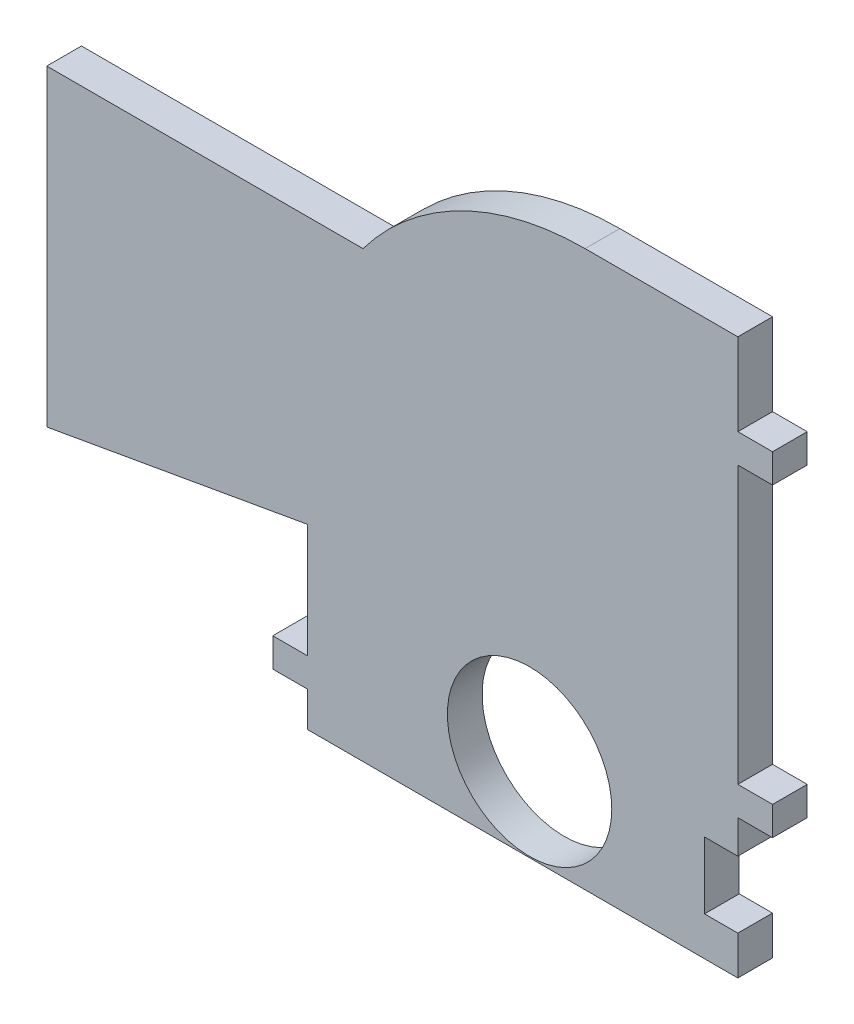
ISO-10303-21;
HEADER;
FILE_DESCRIPTION(('STEP AP214'),'2;1');
FILE_NAME('part.step','',(''),(''),'','','');
FILE_SCHEMA(('AUTOMOTIVE_DESIGN { 1 0 10303 214 1 1 1 1 }'));
ENDSEC;
DATA;
#1=APPLICATION_CONTEXT('core data for automotive mechanical design processes');
#2=APPLICATION_PROTOCOL_DEFINITION('international standard','automotive_design',2000,#1);
#3=PRODUCT_CONTEXT('',#1,'mechanical');
#4=PRODUCT('Part','Part','',(#3));
#5=PRODUCT_RELATED_PRODUCT_CATEGORY('part','',(#4));
#6=PRODUCT_DEFINITION_FORMATION('','',#4);
#7=PRODUCT_DEFINITION_CONTEXT('part definition',#1,'design');
#8=PRODUCT_DEFINITION('design','',#6,#7);
#9=PRODUCT_DEFINITION_SHAPE('','',#8);
#10=(LENGTH_UNIT() NAMED_UNIT(*) SI_UNIT(.MILLI.,.METRE.));
#11=(NAMED_UNIT(*) PLANE_ANGLE_UNIT() SI_UNIT($,.RADIAN.));
#12=(NAMED_UNIT(*) SI_UNIT($,.STERADIAN.) SOLID_ANGLE_UNIT());
#13=UNCERTAINTY_MEASURE_WITH_UNIT(LENGTH_MEASURE(1.E-05),#10,'distance_accuracy_value','');
#14=(GEOMETRIC_REPRESENTATION_CONTEXT(3) GLOBAL_UNCERTAINTY_ASSIGNED_CONTEXT((#13)) GLOBAL_UNIT_ASSIGNED_CONTEXT((#10,
#11,#12)) REPRESENTATION_CONTEXT('',''));
#15=CARTESIAN_POINT('',(0.,0.,0.));
#16=DIRECTION('',(0.,0.,1.));
#17=DIRECTION('',(1.,0.,0.));
#18=AXIS2_PLACEMENT_3D('',#15,#16,#17);
#19=CARTESIAN_POINT('',(-5.48621075951461,21.59,1.5875));
#20=DIRECTION('',(0.,1.,0.));
#21=DIRECTION('',(-1.,0.,0.));
#22=AXIS2_PLACEMENT_3D('',#19,#20,#21);
#23=PLANE('',#22);
#24=DIRECTION('',(1.,0.,0.));
#25=VECTOR('',#24,1.);
#26=CARTESIAN_POINT('',(-5.48621075951461,21.59,0.));
#27=LINE('',#26,#25);
#28=CARTESIAN_POINT('',(2.53999999999987,21.59,0.));
#29=VERTEX_POINT('',#28);
#30=CARTESIAN_POINT('',(9.52499999999987,21.59,0.));
#31=VERTEX_POINT('',#30);
#32=EDGE_CURVE('E231',#29,#31,#27,.T.);
#33=ORIENTED_EDGE('',*,*,#32,.F.);
#34=DIRECTION('',(0.,0.,-1.));
#35=VECTOR('',#34,1.);
#36=CARTESIAN_POINT('',(2.53999999999987,21.59,1.5875));
#37=LINE('',#36,#35);
#38=CARTESIAN_POINT('',(2.53999999999987,21.59,1.5875));
#39=VERTEX_POINT('',#38);
#40=EDGE_CURVE('E11',#39,#29,#37,.T.);
#41=ORIENTED_EDGE('',*,*,#40,.F.);
#42=DIRECTION('',(1.,0.,0.));
#43=VECTOR('',#42,1.);
#44=CARTESIAN_POINT('',(-5.48621075951461,21.59,1.5875));
#45=LINE('',#44,#43);
#46=CARTESIAN_POINT('',(9.52499999999987,21.59,1.5875));
#47=VERTEX_POINT('',#46);
#48=EDGE_CURVE('E432',#39,#47,#45,.T.);
#49=ORIENTED_EDGE('',*,*,#48,.T.);
#50=DIRECTION('',(0.,0.,-1.));
#51=VECTOR('',#50,1.);
#52=CARTESIAN_POINT('',(9.52499999999987,21.59,1.5875));
#53=LINE('',#52,#51);
#54=EDGE_CURVE('E52',#47,#31,#53,.T.);
#55=ORIENTED_EDGE('',*,*,#54,.T.);
#56=EDGE_LOOP('',(#33,#41,#49,#55));
#57=FACE_BOUND('',#56,.T.);
#58=ADVANCED_FACE('F35',(#57),#23,.T.);
#59=CARTESIAN_POINT('',(2.53999999999988,8.89,1.5875));
#60=DIRECTION('',(0.,0.,-1.));
#61=DIRECTION('',(-1.,0.,0.));
#62=AXIS2_PLACEMENT_3D('',#59,#60,#61);
#63=CYLINDRICAL_SURFACE('',#62,12.7);
#64=CARTESIAN_POINT('',(2.53999999999988,8.89,0.));
#65=DIRECTION('',(0.,0.,1.));
#66=DIRECTION('',(1.,0.,0.));
#67=AXIS2_PLACEMENT_3D('',#64,#65,#66);
#68=CIRCLE('',#67,12.7);
#69=CARTESIAN_POINT('',(-7.62000000000013,16.51,0.));
#70=VERTEX_POINT('',#69);
#71=EDGE_CURVE('E233',#29,#70,#68,.T.);
#72=ORIENTED_EDGE('',*,*,#71,.T.);
#73=DIRECTION('',(0.,0.,-1.));
#74=VECTOR('',#73,1.);
#75=CARTESIAN_POINT('',(-7.62000000000013,16.51,1.5875));
#76=LINE('',#75,#74);
#77=CARTESIAN_POINT('',(-7.62000000000013,16.51,1.5875));
#78=VERTEX_POINT('',#77);
#79=EDGE_CURVE('E44',#78,#70,#76,.T.);
#80=ORIENTED_EDGE('',*,*,#79,.F.);
#81=CARTESIAN_POINT('',(2.53999999999988,8.89,1.5875));
#82=DIRECTION('',(0.,0.,1.));
#83=DIRECTION('',(1.,0.,0.));
#84=AXIS2_PLACEMENT_3D('',#81,#82,#83);
#85=CIRCLE('',#84,12.7);
#86=EDGE_CURVE('E434',#39,#78,#85,.T.);
#87=ORIENTED_EDGE('',*,*,#86,.F.);
#88=ORIENTED_EDGE('',*,*,#40,.T.);
#89=EDGE_LOOP('',(#72,#80,#87,#88));
#90=FACE_BOUND('',#89,.T.);
#91=ADVANCED_FACE('F342',(#90),#63,.T.);
#92=CARTESIAN_POINT('',(-5.48621075951466,16.51,1.5875));
#93=DIRECTION('',(0.,-1.,0.));
#94=DIRECTION('',(1.,0.,0.));
#95=AXIS2_PLACEMENT_3D('',#92,#93,#94);
#96=PLANE('',#95);
#97=DIRECTION('',(-1.,0.,0.));
#98=VECTOR('',#97,1.);
#99=CARTESIAN_POINT('',(-5.48621075951466,16.51,0.));
#100=LINE('',#99,#98);
#101=CARTESIAN_POINT('',(-22.0849215190291,16.51,0.));
#102=VERTEX_POINT('',#101);
#103=EDGE_CURVE('E236',#70,#102,#100,.T.);
#104=ORIENTED_EDGE('',*,*,#103,.T.);
#105=DIRECTION('',(0.,0.,-1.));
#106=VECTOR('',#105,1.);
#107=CARTESIAN_POINT('',(-22.0849215190291,16.51,1.5875));
#108=LINE('',#107,#106);
#109=CARTESIAN_POINT('',(-22.0849215190291,16.51,1.5875));
#110=VERTEX_POINT('',#109);
#111=EDGE_CURVE('E332',#110,#102,#108,.T.);
#112=ORIENTED_EDGE('',*,*,#111,.F.);
#113=DIRECTION('',(-1.,0.,0.));
#114=VECTOR('',#113,1.);
#115=CARTESIAN_POINT('',(-5.48621075951466,16.51,1.5875));
#116=LINE('',#115,#114);
#117=EDGE_CURVE('E338',#78,#110,#116,.T.);
#118=ORIENTED_EDGE('',*,*,#117,.F.);
#119=ORIENTED_EDGE('',*,*,#79,.T.);
#120=EDGE_LOOP('',(#104,#112,#118,#119));
#121=FACE_BOUND('',#120,.T.);
#122=ADVANCED_FACE('F336',(#121),#96,.F.);
#123=CARTESIAN_POINT('',(-22.0849215190291,-23.764086908062,1.5875));
#124=DIRECTION('',(-1.,0.,0.));
#125=DIRECTION('',(0.,0.,1.));
#126=AXIS2_PLACEMENT_3D('',#123,#124,#125);
#127=PLANE('',#126);
#128=DIRECTION('',(0.,1.,0.));
#129=VECTOR('',#128,1.);
#130=CARTESIAN_POINT('',(-22.0849215190291,-23.764086908062,0.));
#131=LINE('',#130,#129);
#132=CARTESIAN_POINT('',(-22.0849215190291,2.21200741234465,0.));
#133=VERTEX_POINT('',#132);
#134=EDGE_CURVE('E239',#133,#102,#131,.T.);
#135=ORIENTED_EDGE('',*,*,#134,.F.);
#136=DIRECTION('',(0.,0.,-1.));
#137=VECTOR('',#136,1.);
#138=CARTESIAN_POINT('',(-22.0849215190291,2.21200741234465,1.5875));
#139=LINE('',#138,#137);
#140=CARTESIAN_POINT('',(-22.0849215190291,2.21200741234465,1.5875));
#141=VERTEX_POINT('',#140);
#142=EDGE_CURVE('E330',#141,#133,#139,.T.);
#143=ORIENTED_EDGE('',*,*,#142,.F.);
#144=DIRECTION('',(0.,1.,0.));
#145=VECTOR('',#144,1.);
#146=CARTESIAN_POINT('',(-22.0849215190291,-23.764086908062,1.5875));
#147=LINE('',#146,#145);
#148=EDGE_CURVE('E439',#141,#110,#147,.T.);
#149=ORIENTED_EDGE('',*,*,#148,.T.);
#150=ORIENTED_EDGE('',*,*,#111,.T.);
#151=EDGE_LOOP('',(#135,#143,#149,#150));
#152=FACE_BOUND('',#151,.T.);
#153=ADVANCED_FACE('F354',(#152),#127,.T.);
#154=CARTESIAN_POINT('',(-10.4369894152439,4.26908247425933,1.5875));
#155=DIRECTION('',(-0.173913043478261,0.984761013296185,0.));
#156=DIRECTION('',(-0.984761013296185,-0.173913043478261,0.));
#157=AXIS2_PLACEMENT_3D('',#154,#155,#156);
#158=PLANE('',#157);
#159=DIRECTION('',(0.984761013296185,0.173913043478261,0.));
#160=VECTOR('',#159,1.);
#161=CARTESIAN_POINT('',(-10.4369894152439,4.26908247425933,0.));
#162=LINE('',#161,#160);
#163=CARTESIAN_POINT('',(-10.1600000000001,4.31799999999998,0.));
#164=VERTEX_POINT('',#163);
#165=EDGE_CURVE('E242',#133,#164,#162,.T.);
#166=ORIENTED_EDGE('',*,*,#165,.T.);
#167=DIRECTION('',(0.,0.,-1.));
#168=VECTOR('',#167,1.);
#169=CARTESIAN_POINT('',(-10.1600000000001,4.31799999999998,1.5875));
#170=LINE('',#169,#168);
#171=CARTESIAN_POINT('',(-10.1600000000001,4.31799999999998,1.5875));
#172=VERTEX_POINT('',#171);
#173=EDGE_CURVE('E327',#172,#164,#170,.T.);
#174=ORIENTED_EDGE('',*,*,#173,.F.);
#175=DIRECTION('',(0.984761013296185,0.173913043478261,0.));
#176=VECTOR('',#175,1.);
#177=CARTESIAN_POINT('',(-10.4369894152439,4.26908247425933,1.5875));
#178=LINE('',#177,#176);
#179=EDGE_CURVE('E442',#141,#172,#178,.T.);
#180=ORIENTED_EDGE('',*,*,#179,.F.);
#181=ORIENTED_EDGE('',*,*,#142,.T.);
#182=EDGE_LOOP('',(#166,#174,#180,#181));
#183=FACE_BOUND('',#182,.T.);
#184=ADVANCED_FACE('F357',(#183),#158,.F.);
#185=CARTESIAN_POINT('',(-10.1600000000001,-23.764086908062,1.5875));
#186=DIRECTION('',(1.,0.,0.));
#187=DIRECTION('',(0.,1.,0.));
#188=AXIS2_PLACEMENT_3D('',#185,#186,#187);
#189=PLANE('',#188);
#190=DIRECTION('',(0.,-1.,0.));
#191=VECTOR('',#190,1.);
#192=CARTESIAN_POINT('',(-10.1600000000001,-23.764086908062,0.));
#193=LINE('',#192,#191);
#194=CARTESIAN_POINT('',(-10.1600000000001,-0.889000000000008,0.));
#195=VERTEX_POINT('',#194);
#196=EDGE_CURVE('E245',#164,#195,#193,.T.);
#197=ORIENTED_EDGE('',*,*,#196,.T.);
#198=DIRECTION('',(0.,0.,-1.));
#199=VECTOR('',#198,1.);
#200=CARTESIAN_POINT('',(-10.1600000000001,-0.889000000000008,1.5875));
#201=LINE('',#200,#199);
#202=CARTESIAN_POINT('',(-10.1600000000001,-0.889000000000008,1.5875));
#203=VERTEX_POINT('',#202);
#204=EDGE_CURVE('E325',#203,#195,#201,.T.);
#205=ORIENTED_EDGE('',*,*,#204,.F.);
#206=DIRECTION('',(0.,-1.,0.));
#207=VECTOR('',#206,1.);
#208=CARTESIAN_POINT('',(-10.1600000000001,-23.764086908062,1.5875));
#209=LINE('',#208,#207);
#210=EDGE_CURVE('E445',#172,#203,#209,.T.);
#211=ORIENTED_EDGE('',*,*,#210,.F.);
#212=ORIENTED_EDGE('',*,*,#173,.T.);
#213=EDGE_LOOP('',(#197,#205,#211,#212));
#214=FACE_BOUND('',#213,.T.);
#215=ADVANCED_FACE('F361',(#214),#189,.F.);
#216=CARTESIAN_POINT('',(-5.48621075951464,-0.889000000000008,1.5875));
#217=DIRECTION('',(0.,1.,0.));
#218=DIRECTION('',(0.,0.,1.));
#219=AXIS2_PLACEMENT_3D('',#216,#217,#218);
#220=PLANE('',#219);
#221=DIRECTION('',(1.,0.,0.));
#222=VECTOR('',#221,1.);
#223=CARTESIAN_POINT('',(-5.48621075951464,-0.889000000000008,0.));
#224=LINE('',#223,#222);
#225=CARTESIAN_POINT('',(-11.7475000000001,-0.889000000000008,0.));
#226=VERTEX_POINT('',#225);
#227=EDGE_CURVE('E248',#226,#195,#224,.T.);
#228=ORIENTED_EDGE('',*,*,#227,.F.);
#229=DIRECTION('',(0.,0.,-1.));
#230=VECTOR('',#229,1.);
#231=CARTESIAN_POINT('',(-11.7475000000001,-0.889000000000008,1.5875));
#232=LINE('',#231,#230);
#233=CARTESIAN_POINT('',(-11.7475000000001,-0.889000000000008,1.5875));
#234=VERTEX_POINT('',#233);
#235=EDGE_CURVE('E323',#234,#226,#232,.T.);
#236=ORIENTED_EDGE('',*,*,#235,.F.);
#237=DIRECTION('',(1.,0.,0.));
#238=VECTOR('',#237,1.);
#239=CARTESIAN_POINT('',(-5.48621075951464,-0.889000000000008,1.5875));
#240=LINE('',#239,#238);
#241=EDGE_CURVE('E447',#234,#203,#240,.T.);
#242=ORIENTED_EDGE('',*,*,#241,.T.);
#243=ORIENTED_EDGE('',*,*,#204,.T.);
#244=EDGE_LOOP('',(#228,#236,#242,#243));
#245=FACE_BOUND('',#244,.T.);
#246=ADVANCED_FACE('F363',(#245),#220,.T.);
#247=CARTESIAN_POINT('',(-11.7475000000001,-23.764086908062,1.5875));
#248=DIRECTION('',(-1.,0.,0.));
#249=DIRECTION('',(0.,0.,1.));
#250=AXIS2_PLACEMENT_3D('',#247,#248,#249);
#251=PLANE('',#250);
#252=DIRECTION('',(0.,1.,0.));
#253=VECTOR('',#252,1.);
#254=CARTESIAN_POINT('',(-11.7475000000001,-23.764086908062,0.));
#255=LINE('',#254,#253);
#256=CARTESIAN_POINT('',(-11.7475000000001,-2.20980000000001,0.));
#257=VERTEX_POINT('',#256);
#258=EDGE_CURVE('E252',#257,#226,#255,.T.);
#259=ORIENTED_EDGE('',*,*,#258,.F.);
#260=DIRECTION('',(0.,0.,-1.));
#261=VECTOR('',#260,1.);
#262=CARTESIAN_POINT('',(-11.7475000000001,-2.20980000000001,1.5875));
#263=LINE('',#262,#261);
#264=CARTESIAN_POINT('',(-11.7475000000001,-2.20980000000001,1.5875));
#265=VERTEX_POINT('',#264);
#266=EDGE_CURVE('E321',#265,#257,#263,.T.);
#267=ORIENTED_EDGE('',*,*,#266,.F.);
#268=DIRECTION('',(0.,1.,0.));
#269=VECTOR('',#268,1.);
#270=CARTESIAN_POINT('',(-11.7475000000001,-23.764086908062,1.5875));
#271=LINE('',#270,#269);
#272=EDGE_CURVE('E451',#265,#234,#271,.T.);
#273=ORIENTED_EDGE('',*,*,#272,.T.);
#274=ORIENTED_EDGE('',*,*,#235,.T.);
#275=EDGE_LOOP('',(#259,#267,#273,#274));
#276=FACE_BOUND('',#275,.T.);
#277=ADVANCED_FACE('F366',(#276),#251,.T.);
#278=CARTESIAN_POINT('',(-5.48621075951464,-2.20980000000001,1.5875));
#279=DIRECTION('',(0.,1.,0.));
#280=DIRECTION('',(0.,0.,1.));
#281=AXIS2_PLACEMENT_3D('',#278,#279,#280);
#282=PLANE('',#281);
#283=DIRECTION('',(1.,0.,0.));
#284=VECTOR('',#283,1.);
#285=CARTESIAN_POINT('',(-5.48621075951464,-2.20980000000001,0.));
#286=LINE('',#285,#284);
#287=CARTESIAN_POINT('',(-10.1600000000001,-2.20980000000001,0.));
#288=VERTEX_POINT('',#287);
#289=EDGE_CURVE('E255',#257,#288,#286,.T.);
#290=ORIENTED_EDGE('',*,*,#289,.T.);
#291=DIRECTION('',(0.,0.,-1.));
#292=VECTOR('',#291,1.);
#293=CARTESIAN_POINT('',(-10.1600000000001,-2.20980000000001,1.5875));
#294=LINE('',#293,#292);
#295=CARTESIAN_POINT('',(-10.1600000000001,-2.20980000000001,1.5875));
#296=VERTEX_POINT('',#295);
#297=EDGE_CURVE('E318',#296,#288,#294,.T.);
#298=ORIENTED_EDGE('',*,*,#297,.F.);
#299=DIRECTION('',(1.,0.,0.));
#300=VECTOR('',#299,1.);
#301=CARTESIAN_POINT('',(-5.48621075951464,-2.20980000000001,1.5875));
#302=LINE('',#301,#300);
#303=EDGE_CURVE('E454',#265,#296,#302,.T.);
#304=ORIENTED_EDGE('',*,*,#303,.F.);
#305=ORIENTED_EDGE('',*,*,#266,.T.);
#306=EDGE_LOOP('',(#290,#298,#304,#305));
#307=FACE_BOUND('',#306,.T.);
#308=ADVANCED_FACE('F370',(#307),#282,.F.);
#309=CARTESIAN_POINT('',(-10.1600000000001,-3.81,0.));
#310=VERTEX_POINT('',#309);
#311=EDGE_CURVE('E249',#288,#310,#193,.T.);
#312=ORIENTED_EDGE('',*,*,#311,.T.);
#313=DIRECTION('',(0.,0.,-1.));
#314=VECTOR('',#313,1.);
#315=CARTESIAN_POINT('',(-10.1600000000001,-3.81,1.5875));
#316=LINE('',#315,#314);
#317=CARTESIAN_POINT('',(-10.1600000000001,-3.81,1.5875));
#318=VERTEX_POINT('',#317);
#319=EDGE_CURVE('E315',#318,#310,#316,.T.);
#320=ORIENTED_EDGE('',*,*,#319,.F.);
#321=EDGE_CURVE('E448',#296,#318,#209,.T.);
#322=ORIENTED_EDGE('',*,*,#321,.F.);
#323=ORIENTED_EDGE('',*,*,#297,.T.);
#324=EDGE_LOOP('',(#312,#320,#322,#323));
#325=FACE_BOUND('',#324,.T.);
#326=ADVANCED_FACE('F374',(#325),#189,.F.);
#327=CARTESIAN_POINT('',(-5.48621075951464,-3.81,1.5875));
#328=DIRECTION('',(0.,1.,0.));
#329=DIRECTION('',(0.,0.,1.));
#330=AXIS2_PLACEMENT_3D('',#327,#328,#329);
#331=PLANE('',#330);
#332=DIRECTION('',(1.,0.,0.));
#333=VECTOR('',#332,1.);
#334=CARTESIAN_POINT('',(-5.48621075951464,-3.81,0.));
#335=LINE('',#334,#333);
#336=CARTESIAN_POINT('',(9.52499999999988,-3.81,0.));
#337=VERTEX_POINT('',#336);
#338=EDGE_CURVE('E258',#310,#337,#335,.T.);
#339=ORIENTED_EDGE('',*,*,#338,.T.);
#340=DIRECTION('',(0.,0.,-1.));
#341=VECTOR('',#340,1.);
#342=CARTESIAN_POINT('',(9.52499999999988,-3.81,1.5875));
#343=LINE('',#342,#341);
#344=CARTESIAN_POINT('',(9.52499999999988,-3.81,1.5875));
#345=VERTEX_POINT('',#344);
#346=EDGE_CURVE('E313',#345,#337,#343,.T.);
#347=ORIENTED_EDGE('',*,*,#346,.F.);
#348=DIRECTION('',(1.,0.,0.));
#349=VECTOR('',#348,1.);
#350=CARTESIAN_POINT('',(-5.48621075951464,-3.81,1.5875));
#351=LINE('',#350,#349);
#352=EDGE_CURVE('E457',#318,#345,#351,.T.);
#353=ORIENTED_EDGE('',*,*,#352,.F.);
#354=ORIENTED_EDGE('',*,*,#319,.T.);
#355=EDGE_LOOP('',(#339,#347,#353,#354));
#356=FACE_BOUND('',#355,.T.);
#357=ADVANCED_FACE('F378',(#356),#331,.F.);
#358=CARTESIAN_POINT('',(9.52499999999989,-23.764086908062,1.5875));
#359=DIRECTION('',(1.,0.,0.));
#360=DIRECTION('',(0.,1.,0.));
#361=AXIS2_PLACEMENT_3D('',#358,#359,#360);
#362=PLANE('',#361);
#363=DIRECTION('',(0.,-1.,0.));
#364=VECTOR('',#363,1.);
#365=CARTESIAN_POINT('',(9.52499999999989,-23.764086908062,0.));
#366=LINE('',#365,#364);
#367=CARTESIAN_POINT('',(9.52499999999988,-2.032,0.));
#368=VERTEX_POINT('',#367);
#369=EDGE_CURVE('E261',#368,#337,#366,.T.);
#370=ORIENTED_EDGE('',*,*,#369,.F.);
#371=DIRECTION('',(0.,0.,-1.));
#372=VECTOR('',#371,1.);
#373=CARTESIAN_POINT('',(9.52499999999988,-2.032,1.5875));
#374=LINE('',#373,#372);
#375=CARTESIAN_POINT('',(9.52499999999988,-2.032,1.5875));
#376=VERTEX_POINT('',#375);
#377=EDGE_CURVE('E311',#376,#368,#374,.T.);
#378=ORIENTED_EDGE('',*,*,#377,.F.);
#379=DIRECTION('',(0.,-1.,0.));
#380=VECTOR('',#379,1.);
#381=CARTESIAN_POINT('',(9.52499999999989,-23.764086908062,1.5875));
#382=LINE('',#381,#380);
#383=EDGE_CURVE('E225',#376,#345,#382,.T.);
#384=ORIENTED_EDGE('',*,*,#383,.T.);
#385=ORIENTED_EDGE('',*,*,#346,.T.);
#386=EDGE_LOOP('',(#370,#378,#384,#385));
#387=FACE_BOUND('',#386,.T.);
#388=ADVANCED_FACE('F382',(#387),#362,.T.);
#389=CARTESIAN_POINT('',(-5.48621075951464,-2.032,1.5875));
#390=DIRECTION('',(0.,-1.,0.));
#391=DIRECTION('',(0.,0.,-1.));
#392=AXIS2_PLACEMENT_3D('',#389,#390,#391);
#393=PLANE('',#392);
#394=DIRECTION('',(-1.,0.,0.));
#395=VECTOR('',#394,1.);
#396=CARTESIAN_POINT('',(-5.48621075951464,-2.032,0.));
#397=LINE('',#396,#395);
#398=CARTESIAN_POINT('',(8.00099999999988,-2.032,0.));
#399=VERTEX_POINT('',#398);
#400=EDGE_CURVE('E264',#368,#399,#397,.T.);
#401=ORIENTED_EDGE('',*,*,#400,.T.);
#402=DIRECTION('',(0.,0.,-1.));
#403=VECTOR('',#402,1.);
#404=CARTESIAN_POINT('',(8.00099999999988,-2.032,1.5875));
#405=LINE('',#404,#403);
#406=CARTESIAN_POINT('',(8.00099999999988,-2.032,1.5875));
#407=VERTEX_POINT('',#406);
#408=EDGE_CURVE('E309',#407,#399,#405,.T.);
#409=ORIENTED_EDGE('',*,*,#408,.F.);
#410=DIRECTION('',(-1.,0.,0.));
#411=VECTOR('',#410,1.);
#412=CARTESIAN_POINT('',(-5.48621075951464,-2.032,1.5875));
#413=LINE('',#412,#411);
#414=EDGE_CURVE('E460',#376,#407,#413,.T.);
#415=ORIENTED_EDGE('',*,*,#414,.F.);
#416=ORIENTED_EDGE('',*,*,#377,.T.);
#417=EDGE_LOOP('',(#401,#409,#415,#416));
#418=FACE_BOUND('',#417,.T.);
#419=ADVANCED_FACE('F384',(#418),#393,.F.);
#420=CARTESIAN_POINT('',(8.00099999999988,-23.764086908062,1.5875));
#421=DIRECTION('',(1.,0.,0.));
#422=DIRECTION('',(0.,0.,-1.));
#423=AXIS2_PLACEMENT_3D('',#420,#421,#422);
#424=PLANE('',#423);
#425=DIRECTION('',(0.,-1.,0.));
#426=VECTOR('',#425,1.);
#427=CARTESIAN_POINT('',(8.00099999999988,-23.764086908062,0.));
#428=LINE('',#427,#426);
#429=CARTESIAN_POINT('',(8.00099999999988,1.016,0.));
#430=VERTEX_POINT('',#429);
#431=EDGE_CURVE('E269',#430,#399,#428,.T.);
#432=ORIENTED_EDGE('',*,*,#431,.F.);
#433=DIRECTION('',(0.,0.,-1.));
#434=VECTOR('',#433,1.);
#435=CARTESIAN_POINT('',(8.00099999999988,1.016,1.5875));
#436=LINE('',#435,#434);
#437=CARTESIAN_POINT('',(8.00099999999988,1.016,1.5875));
#438=VERTEX_POINT('',#437);
#439=EDGE_CURVE('E307',#438,#430,#436,.T.);
#440=ORIENTED_EDGE('',*,*,#439,.F.);
#441=DIRECTION('',(0.,-1.,0.));
#442=VECTOR('',#441,1.);
#443=CARTESIAN_POINT('',(8.00099999999988,-23.764086908062,1.5875));
#444=LINE('',#443,#442);
#445=EDGE_CURVE('E463',#438,#407,#444,.T.);
#446=ORIENTED_EDGE('',*,*,#445,.T.);
#447=ORIENTED_EDGE('',*,*,#408,.T.);
#448=EDGE_LOOP('',(#432,#440,#446,#447));
#449=FACE_BOUND('',#448,.T.);
#450=ADVANCED_FACE('F387',(#449),#424,.T.);
#451=CARTESIAN_POINT('',(-5.48621075951464,1.016,1.5875));
#452=DIRECTION('',(0.,-1.,0.));
#453=DIRECTION('',(1.,0.,0.));
#454=AXIS2_PLACEMENT_3D('',#451,#452,#453);
#455=PLANE('',#454);
#456=DIRECTION('',(-1.,0.,0.));
#457=VECTOR('',#456,1.);
#458=CARTESIAN_POINT('',(-5.48621075951464,1.016,0.));
#459=LINE('',#458,#457);
#460=CARTESIAN_POINT('',(9.52499999999988,1.016,0.));
#461=VERTEX_POINT('',#460);
#462=EDGE_CURVE('E272',#461,#430,#459,.T.);
#463=ORIENTED_EDGE('',*,*,#462,.F.);
#464=DIRECTION('',(0.,0.,-1.));
#465=VECTOR('',#464,1.);
#466=CARTESIAN_POINT('',(9.52499999999988,1.016,1.5875));
#467=LINE('',#466,#465);
#468=CARTESIAN_POINT('',(9.52499999999988,1.016,1.5875));
#469=VERTEX_POINT('',#468);
#470=EDGE_CURVE('E305',#469,#461,#467,.T.);
#471=ORIENTED_EDGE('',*,*,#470,.F.);
#472=DIRECTION('',(-1.,0.,0.));
#473=VECTOR('',#472,1.);
#474=CARTESIAN_POINT('',(-5.48621075951464,1.016,1.5875));
#475=LINE('',#474,#473);
#476=EDGE_CURVE('E466',#469,#438,#475,.T.);
#477=ORIENTED_EDGE('',*,*,#476,.T.);
#478=ORIENTED_EDGE('',*,*,#439,.T.);
#479=EDGE_LOOP('',(#463,#471,#477,#478));
#480=FACE_BOUND('',#479,.T.);
#481=ADVANCED_FACE('F391',(#480),#455,.T.);
#482=CARTESIAN_POINT('',(9.52499999999988,2.54,0.));
#483=VERTEX_POINT('',#482);
#484=EDGE_CURVE('E266',#483,#461,#366,.T.);
#485=ORIENTED_EDGE('',*,*,#484,.F.);
#486=DIRECTION('',(0.,0.,-1.));
#487=VECTOR('',#486,1.);
#488=CARTESIAN_POINT('',(9.52499999999988,2.54,1.5875));
#489=LINE('',#488,#487);
#490=CARTESIAN_POINT('',(9.52499999999988,2.54,1.5875));
#491=VERTEX_POINT('',#490);
#492=EDGE_CURVE('E303',#491,#483,#489,.T.);
#493=ORIENTED_EDGE('',*,*,#492,.F.);
#494=EDGE_CURVE('E461',#491,#469,#382,.T.);
#495=ORIENTED_EDGE('',*,*,#494,.T.);
#496=ORIENTED_EDGE('',*,*,#470,.T.);
#497=EDGE_LOOP('',(#485,#493,#495,#496));
#498=FACE_BOUND('',#497,.T.);
#499=ADVANCED_FACE('F395',(#498),#362,.T.);
#500=CARTESIAN_POINT('',(-5.48621075951464,2.54,1.5875));
#501=DIRECTION('',(0.,1.,0.));
#502=DIRECTION('',(0.,0.,1.));
#503=AXIS2_PLACEMENT_3D('',#500,#501,#502);
#504=PLANE('',#503);
#505=DIRECTION('',(1.,0.,0.));
#506=VECTOR('',#505,1.);
#507=CARTESIAN_POINT('',(-5.48621075951464,2.54,0.));
#508=LINE('',#507,#506);
#509=CARTESIAN_POINT('',(11.1124999999999,2.54,0.));
#510=VERTEX_POINT('',#509);
#511=EDGE_CURVE('E275',#483,#510,#508,.T.);
#512=ORIENTED_EDGE('',*,*,#511,.T.);
#513=DIRECTION('',(0.,0.,-1.));
#514=VECTOR('',#513,1.);
#515=CARTESIAN_POINT('',(11.1124999999999,2.54,1.5875));
#516=LINE('',#515,#514);
#517=CARTESIAN_POINT('',(11.1124999999999,2.54,1.5875));
#518=VERTEX_POINT('',#517);
#519=EDGE_CURVE('E300',#518,#510,#516,.T.);
#520=ORIENTED_EDGE('',*,*,#519,.F.);
#521=DIRECTION('',(1.,0.,0.));
#522=VECTOR('',#521,1.);
#523=CARTESIAN_POINT('',(-5.48621075951464,2.54,1.5875));
#524=LINE('',#523,#522);
#525=EDGE_CURVE('E469',#491,#518,#524,.T.);
#526=ORIENTED_EDGE('',*,*,#525,.F.);
#527=ORIENTED_EDGE('',*,*,#492,.T.);
#528=EDGE_LOOP('',(#512,#520,#526,#527));
#529=FACE_BOUND('',#528,.T.);
#530=ADVANCED_FACE('F397',(#529),#504,.F.);
#531=CARTESIAN_POINT('',(11.1124999999999,-23.764086908062,1.5875));
#532=DIRECTION('',(-1.,0.,0.));
#533=DIRECTION('',(0.,0.,1.));
#534=AXIS2_PLACEMENT_3D('',#531,#532,#533);
#535=PLANE('',#534);
#536=DIRECTION('',(0.,1.,0.));
#537=VECTOR('',#536,1.);
#538=CARTESIAN_POINT('',(11.1124999999999,-23.764086908062,0.));
#539=LINE('',#538,#537);
#540=CARTESIAN_POINT('',(11.1124999999999,3.8608,0.));
#541=VERTEX_POINT('',#540);
#542=EDGE_CURVE('E278',#510,#541,#539,.T.);
#543=ORIENTED_EDGE('',*,*,#542,.T.);
#544=DIRECTION('',(0.,0.,-1.));
#545=VECTOR('',#544,1.);
#546=CARTESIAN_POINT('',(11.1124999999999,3.8608,1.5875));
#547=LINE('',#546,#545);
#548=CARTESIAN_POINT('',(11.1124999999999,3.8608,1.5875));
#549=VERTEX_POINT('',#548);
#550=EDGE_CURVE('E298',#549,#541,#547,.T.);
#551=ORIENTED_EDGE('',*,*,#550,.F.);
#552=DIRECTION('',(0.,1.,0.));
#553=VECTOR('',#552,1.);
#554=CARTESIAN_POINT('',(11.1124999999999,-23.764086908062,1.5875));
#555=LINE('',#554,#553);
#556=EDGE_CURVE('E472',#518,#549,#555,.T.);
#557=ORIENTED_EDGE('',*,*,#556,.F.);
#558=ORIENTED_EDGE('',*,*,#519,.T.);
#559=EDGE_LOOP('',(#543,#551,#557,#558));
#560=FACE_BOUND('',#559,.T.);
#561=ADVANCED_FACE('F400',(#560),#535,.F.);
#562=CARTESIAN_POINT('',(-5.48621075951464,3.8608,1.5875));
#563=DIRECTION('',(0.,1.,0.));
#564=DIRECTION('',(-1.,0.,0.));
#565=AXIS2_PLACEMENT_3D('',#562,#563,#564);
#566=PLANE('',#565);
#567=DIRECTION('',(1.,0.,0.));
#568=VECTOR('',#567,1.);
#569=CARTESIAN_POINT('',(-5.48621075951464,3.8608,0.));
#570=LINE('',#569,#568);
#571=CARTESIAN_POINT('',(9.52499999999988,3.8608,0.));
#572=VERTEX_POINT('',#571);
#573=EDGE_CURVE('E281',#572,#541,#570,.T.);
#574=ORIENTED_EDGE('',*,*,#573,.F.);
#575=DIRECTION('',(0.,0.,-1.));
#576=VECTOR('',#575,1.);
#577=CARTESIAN_POINT('',(9.52499999999988,3.8608,1.5875));
#578=LINE('',#577,#576);
#579=CARTESIAN_POINT('',(9.52499999999988,3.8608,1.5875));
#580=VERTEX_POINT('',#579);
#581=EDGE_CURVE('E296',#580,#572,#578,.T.);
#582=ORIENTED_EDGE('',*,*,#581,.F.);
#583=DIRECTION('',(1.,0.,0.));
#584=VECTOR('',#583,1.);
#585=CARTESIAN_POINT('',(-5.48621075951464,3.8608,1.5875));
#586=LINE('',#585,#584);
#587=EDGE_CURVE('E474',#580,#549,#586,.T.);
#588=ORIENTED_EDGE('',*,*,#587,.T.);
#589=ORIENTED_EDGE('',*,*,#550,.T.);
#590=EDGE_LOOP('',(#574,#582,#588,#589));
#591=FACE_BOUND('',#590,.T.);
#592=ADVANCED_FACE('F404',(#591),#566,.T.);
#593=CARTESIAN_POINT('',(9.52499999999985,16.51,0.));
#594=VERTEX_POINT('',#593);
#595=EDGE_CURVE('E284',#594,#572,#366,.T.);
#596=ORIENTED_EDGE('',*,*,#595,.F.);
#597=DIRECTION('',(0.,0.,-1.));
#598=VECTOR('',#597,1.);
#599=CARTESIAN_POINT('',(9.52499999999985,16.51,1.5875));
#600=LINE('',#599,#598);
#601=CARTESIAN_POINT('',(9.52499999999985,16.51,1.5875));
#602=VERTEX_POINT('',#601);
#603=EDGE_CURVE('E294',#602,#594,#600,.T.);
#604=ORIENTED_EDGE('',*,*,#603,.F.);
#605=EDGE_CURVE('E224',#602,#580,#382,.T.);
#606=ORIENTED_EDGE('',*,*,#605,.T.);
#607=ORIENTED_EDGE('',*,*,#581,.T.);
#608=EDGE_LOOP('',(#596,#604,#606,#607));
#609=FACE_BOUND('',#608,.T.);
#610=ADVANCED_FACE('F408',(#609),#362,.T.);
#611=CARTESIAN_POINT('',(-5.48621075951464,16.51,1.5875));
#612=DIRECTION('',(0.,1.,0.));
#613=DIRECTION('',(0.,0.,1.));
#614=AXIS2_PLACEMENT_3D('',#611,#612,#613);
#615=PLANE('',#614);
#616=DIRECTION('',(1.,0.,0.));
#617=VECTOR('',#616,1.);
#618=CARTESIAN_POINT('',(-5.48621075951464,16.51,0.));
#619=LINE('',#618,#617);
#620=CARTESIAN_POINT('',(11.1124999999998,16.51,0.));
#621=VERTEX_POINT('',#620);
#622=EDGE_CURVE('E285',#594,#621,#619,.T.);
#623=ORIENTED_EDGE('',*,*,#622,.T.);
#624=DIRECTION('',(0.,0.,-1.));
#625=VECTOR('',#624,1.);
#626=CARTESIAN_POINT('',(11.1124999999998,16.51,1.5875));
#627=LINE('',#626,#625);
#628=CARTESIAN_POINT('',(11.1124999999998,16.51,1.5875));
#629=VERTEX_POINT('',#628);
#630=EDGE_CURVE('E218',#629,#621,#627,.T.);
#631=ORIENTED_EDGE('',*,*,#630,.F.);
#632=DIRECTION('',(1.,0.,0.));
#633=VECTOR('',#632,1.);
#634=CARTESIAN_POINT('',(-5.48621075951464,16.51,1.5875));
#635=LINE('',#634,#633);
#636=EDGE_CURVE('E207',#602,#629,#635,.T.);
#637=ORIENTED_EDGE('',*,*,#636,.F.);
#638=ORIENTED_EDGE('',*,*,#603,.T.);
#639=EDGE_LOOP('',(#623,#631,#637,#638));
#640=FACE_BOUND('',#639,.T.);
#641=ADVANCED_FACE('F410',(#640),#615,.F.);
#642=CARTESIAN_POINT('',(11.1124999999997,-23.764086908062,1.5875));
#643=DIRECTION('',(-1.,0.,0.));
#644=DIRECTION('',(0.,-1.,0.));
#645=AXIS2_PLACEMENT_3D('',#642,#643,#644);
#646=PLANE('',#645);
#647=DIRECTION('',(0.,1.,0.));
#648=VECTOR('',#647,1.);
#649=CARTESIAN_POINT('',(11.1124999999997,-23.764086908062,0.));
#650=LINE('',#649,#648);
#651=CARTESIAN_POINT('',(11.1124999999998,17.8308,0.));
#652=VERTEX_POINT('',#651);
#653=EDGE_CURVE('E215',#621,#652,#650,.T.);
#654=ORIENTED_EDGE('',*,*,#653,.T.);
#655=DIRECTION('',(0.,0.,-1.));
#656=VECTOR('',#655,1.);
#657=CARTESIAN_POINT('',(11.1124999999998,17.8308,1.5875));
#658=LINE('',#657,#656);
#659=CARTESIAN_POINT('',(11.1124999999998,17.8308,1.5875));
#660=VERTEX_POINT('',#659);
#661=EDGE_CURVE('E213',#660,#652,#658,.T.);
#662=ORIENTED_EDGE('',*,*,#661,.F.);
#663=DIRECTION('',(0.,1.,0.));
#664=VECTOR('',#663,1.);
#665=CARTESIAN_POINT('',(11.1124999999997,-23.764086908062,1.5875));
#666=LINE('',#665,#664);
#667=EDGE_CURVE('E198',#629,#660,#666,.T.);
#668=ORIENTED_EDGE('',*,*,#667,.F.);
#669=ORIENTED_EDGE('',*,*,#630,.T.);
#670=EDGE_LOOP('',(#654,#662,#668,#669));
#671=FACE_BOUND('',#670,.T.);
#672=ADVANCED_FACE('F214',(#671),#646,.F.);
#673=CARTESIAN_POINT('',(-5.48621075951464,17.8308,1.5875));
#674=DIRECTION('',(0.,1.,0.));
#675=DIRECTION('',(0.,0.,1.));
#676=AXIS2_PLACEMENT_3D('',#673,#674,#675);
#677=PLANE('',#676);
#678=DIRECTION('',(1.,0.,0.));
#679=VECTOR('',#678,1.);
#680=CARTESIAN_POINT('',(-5.48621075951464,17.8308,0.));
#681=LINE('',#680,#679);
#682=CARTESIAN_POINT('',(9.52499999999987,17.8308,0.));
#683=VERTEX_POINT('',#682);
#684=EDGE_CURVE('E289',#683,#652,#681,.T.);
#685=ORIENTED_EDGE('',*,*,#684,.F.);
#686=DIRECTION('',(0.,0.,-1.));
#687=VECTOR('',#686,1.);
#688=CARTESIAN_POINT('',(9.52499999999987,17.8308,1.5875));
#689=LINE('',#688,#687);
#690=CARTESIAN_POINT('',(9.52499999999987,17.8308,1.5875));
#691=VERTEX_POINT('',#690);
#692=EDGE_CURVE('E125',#691,#683,#689,.T.);
#693=ORIENTED_EDGE('',*,*,#692,.F.);
#694=DIRECTION('',(1.,0.,0.));
#695=VECTOR('',#694,1.);
#696=CARTESIAN_POINT('',(-5.48621075951464,17.8308,1.5875));
#697=LINE('',#696,#695);
#698=EDGE_CURVE('E204',#691,#660,#697,.T.);
#699=ORIENTED_EDGE('',*,*,#698,.T.);
#700=ORIENTED_EDGE('',*,*,#661,.T.);
#701=EDGE_LOOP('',(#685,#693,#699,#700));
#702=FACE_BOUND('',#701,.T.);
#703=ADVANCED_FACE('F220',(#702),#677,.T.);
#704=CARTESIAN_POINT('',(0.,0.,1.5875));
#705=DIRECTION('',(0.,0.,-1.));
#706=DIRECTION('',(-1.,0.,0.));
#707=AXIS2_PLACEMENT_3D('',#704,#705,#706);
#708=CYLINDRICAL_SURFACE('',#707,3.7592);
#709=CARTESIAN_POINT('',(0.,0.,1.5875));
#710=DIRECTION('',(0.,0.,1.));
#711=DIRECTION('',(1.,0.,0.));
#712=AXIS2_PLACEMENT_3D('',#709,#710,#711);
#713=CIRCLE('',#712,3.7592);
#714=CARTESIAN_POINT('',(3.7592,0.,1.5875));
#715=VERTEX_POINT('',#714);
#716=EDGE_CURVE('E430',#715,#715,#713,.T.);
#717=ORIENTED_EDGE('',*,*,#716,.T.);
#718=EDGE_LOOP('',(#717));
#719=FACE_BOUND('',#718,.T.);
#720=CARTESIAN_POINT('',(0.,0.,0.));
#721=DIRECTION('',(0.,0.,1.));
#722=DIRECTION('',(1.,0.,0.));
#723=AXIS2_PLACEMENT_3D('',#720,#721,#722);
#724=CIRCLE('',#723,3.7592);
#725=CARTESIAN_POINT('',(3.7592,0.,0.));
#726=VERTEX_POINT('',#725);
#727=EDGE_CURVE('E228',#726,#726,#724,.T.);
#728=ORIENTED_EDGE('',*,*,#727,.F.);
#729=EDGE_LOOP('',(#728));
#730=FACE_BOUND('',#729,.T.);
#731=ADVANCED_FACE('F37',(#719,#730),#708,.F.);
#732=EDGE_CURVE('E265',#31,#683,#366,.T.);
#733=ORIENTED_EDGE('',*,*,#732,.F.);
#734=ORIENTED_EDGE('',*,*,#54,.F.);
#735=EDGE_CURVE('E221',#47,#691,#382,.T.);
#736=ORIENTED_EDGE('',*,*,#735,.T.);
#737=ORIENTED_EDGE('',*,*,#692,.T.);
#738=EDGE_LOOP('',(#733,#734,#736,#737));
#739=FACE_BOUND('',#738,.T.);
#740=ADVANCED_FACE('F418',(#739),#362,.T.);
#741=CARTESIAN_POINT('',(-5.48621075951464,-23.764086908062,1.5875));
#742=DIRECTION('',(0.,0.,1.));
#743=DIRECTION('',(1.,0.,0.));
#744=AXIS2_PLACEMENT_3D('',#741,#742,#743);
#745=PLANE('',#744);
#746=ORIENTED_EDGE('',*,*,#716,.F.);
#747=EDGE_LOOP('',(#746));
#748=FACE_BOUND('',#747,.T.);
#749=ORIENTED_EDGE('',*,*,#48,.F.);
#750=ORIENTED_EDGE('',*,*,#86,.T.);
#751=ORIENTED_EDGE('',*,*,#117,.T.);
#752=ORIENTED_EDGE('',*,*,#148,.F.);
#753=ORIENTED_EDGE('',*,*,#179,.T.);
#754=ORIENTED_EDGE('',*,*,#210,.T.);
#755=ORIENTED_EDGE('',*,*,#241,.F.);
#756=ORIENTED_EDGE('',*,*,#272,.F.);
#757=ORIENTED_EDGE('',*,*,#303,.T.);
#758=ORIENTED_EDGE('',*,*,#321,.T.);
#759=ORIENTED_EDGE('',*,*,#352,.T.);
#760=ORIENTED_EDGE('',*,*,#383,.F.);
#761=ORIENTED_EDGE('',*,*,#414,.T.);
#762=ORIENTED_EDGE('',*,*,#445,.F.);
#763=ORIENTED_EDGE('',*,*,#476,.F.);
#764=ORIENTED_EDGE('',*,*,#494,.F.);
#765=ORIENTED_EDGE('',*,*,#525,.T.);
#766=ORIENTED_EDGE('',*,*,#556,.T.);
#767=ORIENTED_EDGE('',*,*,#587,.F.);
#768=ORIENTED_EDGE('',*,*,#605,.F.);
#769=ORIENTED_EDGE('',*,*,#636,.T.);
#770=ORIENTED_EDGE('',*,*,#667,.T.);
#771=ORIENTED_EDGE('',*,*,#698,.F.);
#772=ORIENTED_EDGE('',*,*,#735,.F.);
#773=EDGE_LOOP('',(#749,#750,#751,#752,#753,#754,#755,#756,#757,#758,#759,#760,#761,#762,#763,
#764,#765,#766,#767,#768,#769,#770,#771,#772));
#774=FACE_BOUND('',#773,.T.);
#775=ADVANCED_FACE('F201',(#748,#774),#745,.T.);
#776=CARTESIAN_POINT('',(-5.48621075951464,-23.764086908062,0.));
#777=DIRECTION('',(0.,0.,1.));
#778=DIRECTION('',(1.,0.,0.));
#779=AXIS2_PLACEMENT_3D('',#776,#777,#778);
#780=PLANE('',#779);
#781=ORIENTED_EDGE('',*,*,#727,.T.);
#782=EDGE_LOOP('',(#781));
#783=FACE_BOUND('',#782,.T.);
#784=ORIENTED_EDGE('',*,*,#32,.T.);
#785=ORIENTED_EDGE('',*,*,#732,.T.);
#786=ORIENTED_EDGE('',*,*,#684,.T.);
#787=ORIENTED_EDGE('',*,*,#653,.F.);
#788=ORIENTED_EDGE('',*,*,#622,.F.);
#789=ORIENTED_EDGE('',*,*,#595,.T.);
#790=ORIENTED_EDGE('',*,*,#573,.T.);
#791=ORIENTED_EDGE('',*,*,#542,.F.);
#792=ORIENTED_EDGE('',*,*,#511,.F.);
#793=ORIENTED_EDGE('',*,*,#484,.T.);
#794=ORIENTED_EDGE('',*,*,#462,.T.);
#795=ORIENTED_EDGE('',*,*,#431,.T.);
#796=ORIENTED_EDGE('',*,*,#400,.F.);
#797=ORIENTED_EDGE('',*,*,#369,.T.);
#798=ORIENTED_EDGE('',*,*,#338,.F.);
#799=ORIENTED_EDGE('',*,*,#311,.F.);
#800=ORIENTED_EDGE('',*,*,#289,.F.);
#801=ORIENTED_EDGE('',*,*,#258,.T.);
#802=ORIENTED_EDGE('',*,*,#227,.T.);
#803=ORIENTED_EDGE('',*,*,#196,.F.);
#804=ORIENTED_EDGE('',*,*,#165,.F.);
#805=ORIENTED_EDGE('',*,*,#134,.T.);
#806=ORIENTED_EDGE('',*,*,#103,.F.);
#807=ORIENTED_EDGE('',*,*,#71,.F.);
#808=EDGE_LOOP('',(#784,#785,#786,#787,#788,#789,#790,#791,#792,#793,#794,#795,#796,#797,#798,
#799,#800,#801,#802,#803,#804,#805,#806,#807));
#809=FACE_BOUND('',#808,.T.);
#810=ADVANCED_FACE('F344',(#783,#809),#780,.F.);
#811=CLOSED_SHELL('',(#58,#91,#122,#153,#184,#215,#246,#277,#308,#326,#357,#388,#419,#450,#481,
#499,#530,#561,#592,#610,#641,#672,#703,#731,#740,#775,#810));
#812=MANIFOLD_SOLID_BREP('B2',#811);
#813=ADVANCED_BREP_SHAPE_REPRESENTATION('',(#18,#812),#14);
#814=SHAPE_DEFINITION_REPRESENTATION(#9,#813);
ENDSEC;
END-ISO-10303-21;
